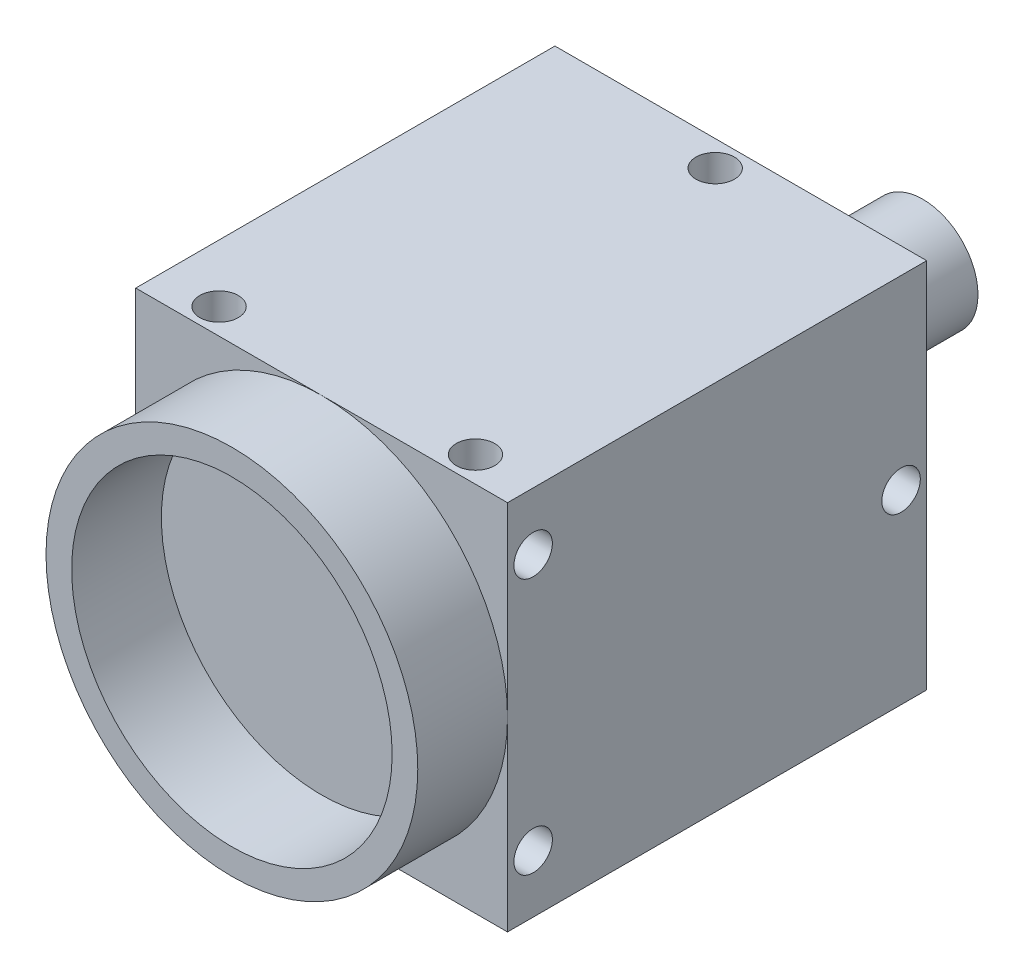
ISO-10303-21;
HEADER;
FILE_DESCRIPTION(('STEP AP214'),'2;1');
FILE_NAME('part.step','',(''),(''),'','','');
FILE_SCHEMA(('AUTOMOTIVE_DESIGN { 1 0 10303 214 1 1 1 1 }'));
ENDSEC;
DATA;
#1=APPLICATION_CONTEXT('core data for automotive mechanical design processes');
#2=APPLICATION_PROTOCOL_DEFINITION('international standard','automotive_design',2000,#1);
#3=PRODUCT_CONTEXT('',#1,'mechanical');
#4=PRODUCT('Part','Part','',(#3));
#5=PRODUCT_RELATED_PRODUCT_CATEGORY('part','',(#4));
#6=PRODUCT_DEFINITION_FORMATION('','',#4);
#7=PRODUCT_DEFINITION_CONTEXT('part definition',#1,'design');
#8=PRODUCT_DEFINITION('design','',#6,#7);
#9=PRODUCT_DEFINITION_SHAPE('','',#8);
#10=(LENGTH_UNIT() NAMED_UNIT(*) SI_UNIT(.MILLI.,.METRE.));
#11=(NAMED_UNIT(*) PLANE_ANGLE_UNIT() SI_UNIT($,.RADIAN.));
#12=(NAMED_UNIT(*) SI_UNIT($,.STERADIAN.) SOLID_ANGLE_UNIT());
#13=UNCERTAINTY_MEASURE_WITH_UNIT(LENGTH_MEASURE(1.E-05),#10,'distance_accuracy_value','');
#14=(GEOMETRIC_REPRESENTATION_CONTEXT(3) GLOBAL_UNCERTAINTY_ASSIGNED_CONTEXT((#13)) GLOBAL_UNIT_ASSIGNED_CONTEXT((#10,
#11,#12)) REPRESENTATION_CONTEXT('',''));
#15=CARTESIAN_POINT('',(0.,0.,0.));
#16=DIRECTION('',(0.,0.,1.));
#17=DIRECTION('',(1.,0.,0.));
#18=AXIS2_PLACEMENT_3D('',#15,#16,#17);
#19=CARTESIAN_POINT('',(-14.5,29.,-16.35));
#20=DIRECTION('',(0.,0.,1.));
#21=DIRECTION('',(1.,0.,0.));
#22=AXIS2_PLACEMENT_3D('',#19,#20,#21);
#23=PLANE('',#22);
#24=CARTESIAN_POINT('',(7.3,21.8,-16.35));
#25=DIRECTION('',(0.,0.,1.));
#26=DIRECTION('',(1.,0.,0.));
#27=AXIS2_PLACEMENT_3D('',#24,#25,#26);
#28=CIRCLE('',#27,4.3);
#29=CARTESIAN_POINT('',(11.6,21.8,-16.35));
#30=VERTEX_POINT('',#29);
#31=EDGE_CURVE('E11',#30,#30,#28,.F.);
#32=ORIENTED_EDGE('',*,*,#31,.F.);
#33=EDGE_LOOP('',(#32));
#34=FACE_BOUND('',#33,.T.);
#35=DIRECTION('',(0.,1.,0.));
#36=VECTOR('',#35,1.);
#37=CARTESIAN_POINT('',(-8.15,15.8,-16.35));
#38=LINE('',#37,#36);
#39=CARTESIAN_POINT('',(-8.15,0.,-16.35));
#40=VERTEX_POINT('',#39);
#41=CARTESIAN_POINT('',(-8.15,15.8,-16.35));
#42=VERTEX_POINT('',#41);
#43=EDGE_CURVE('E135',#40,#42,#38,.T.);
#44=ORIENTED_EDGE('',*,*,#43,.F.);
#45=DIRECTION('',(-1.,0.,0.));
#46=VECTOR('',#45,1.);
#47=CARTESIAN_POINT('',(-14.5,0.,-16.35));
#48=LINE('',#47,#46);
#49=CARTESIAN_POINT('',(-14.5,0.,-16.35));
#50=VERTEX_POINT('',#49);
#51=EDGE_CURVE('E221',#40,#50,#48,.T.);
#52=ORIENTED_EDGE('',*,*,#51,.T.);
#53=DIRECTION('',(0.,-1.,0.));
#54=VECTOR('',#53,1.);
#55=CARTESIAN_POINT('',(-14.5,29.,-16.35));
#56=LINE('',#55,#54);
#57=CARTESIAN_POINT('',(-14.5,29.,-16.35));
#58=VERTEX_POINT('',#57);
#59=EDGE_CURVE('E236',#58,#50,#56,.T.);
#60=ORIENTED_EDGE('',*,*,#59,.F.);
#61=DIRECTION('',(-1.,0.,0.));
#62=VECTOR('',#61,1.);
#63=CARTESIAN_POINT('',(-14.5,29.,-16.35));
#64=LINE('',#63,#62);
#65=CARTESIAN_POINT('',(14.5,29.,-16.35));
#66=VERTEX_POINT('',#65);
#67=EDGE_CURVE('E209',#66,#58,#64,.T.);
#68=ORIENTED_EDGE('',*,*,#67,.F.);
#69=DIRECTION('',(0.,-1.,0.));
#70=VECTOR('',#69,1.);
#71=CARTESIAN_POINT('',(14.5,29.,-16.35));
#72=LINE('',#71,#70);
#73=CARTESIAN_POINT('',(14.5,0.,-16.35));
#74=VERTEX_POINT('',#73);
#75=EDGE_CURVE('E238',#66,#74,#72,.T.);
#76=ORIENTED_EDGE('',*,*,#75,.T.);
#77=CARTESIAN_POINT('',(8.15,0.,-16.35));
#78=VERTEX_POINT('',#77);
#79=EDGE_CURVE('E222',#74,#78,#48,.T.);
#80=ORIENTED_EDGE('',*,*,#79,.T.);
#81=DIRECTION('',(0.,-1.,0.));
#82=VECTOR('',#81,1.);
#83=CARTESIAN_POINT('',(8.15,15.8,-16.35));
#84=LINE('',#83,#82);
#85=CARTESIAN_POINT('',(8.15,15.8,-16.35));
#86=VERTEX_POINT('',#85);
#87=EDGE_CURVE('E58',#86,#78,#84,.T.);
#88=ORIENTED_EDGE('',*,*,#87,.F.);
#89=DIRECTION('',(1.,0.,0.));
#90=VECTOR('',#89,1.);
#91=CARTESIAN_POINT('',(8.15,15.8,-16.35));
#92=LINE('',#91,#90);
#93=EDGE_CURVE('E53',#42,#86,#92,.T.);
#94=ORIENTED_EDGE('',*,*,#93,.F.);
#95=EDGE_LOOP('',(#44,#52,#60,#68,#76,#80,#88,#94));
#96=FACE_BOUND('',#95,.T.);
#97=ADVANCED_FACE('F38',(#34,#96),#23,.F.);
#98=CARTESIAN_POINT('',(-14.5,29.,16.35));
#99=DIRECTION('',(0.,0.,-1.));
#100=DIRECTION('',(-1.,0.,0.));
#101=AXIS2_PLACEMENT_3D('',#98,#99,#100);
#102=PLANE('',#101);
#103=CARTESIAN_POINT('',(0.,14.5,16.35));
#104=DIRECTION('',(0.,0.,1.));
#105=DIRECTION('',(1.,0.,0.));
#106=AXIS2_PLACEMENT_3D('',#103,#104,#105);
#107=CIRCLE('',#106,14.5);
#108=CARTESIAN_POINT('',(14.5,14.5,16.35));
#109=VERTEX_POINT('',#108);
#110=CARTESIAN_POINT('',(0.,29.,16.35));
#111=VERTEX_POINT('',#110);
#112=EDGE_CURVE('E196',#109,#111,#107,.T.);
#113=ORIENTED_EDGE('',*,*,#112,.F.);
#114=DIRECTION('',(0.,-1.,0.));
#115=VECTOR('',#114,1.);
#116=CARTESIAN_POINT('',(14.5,29.,16.35));
#117=LINE('',#116,#115);
#118=CARTESIAN_POINT('',(14.5,29.,16.35));
#119=VERTEX_POINT('',#118);
#120=EDGE_CURVE('E230',#119,#109,#117,.T.);
#121=ORIENTED_EDGE('',*,*,#120,.F.);
#122=DIRECTION('',(1.,0.,0.));
#123=VECTOR('',#122,1.);
#124=CARTESIAN_POINT('',(-14.5,29.,16.35));
#125=LINE('',#124,#123);
#126=EDGE_CURVE('E214',#111,#119,#125,.T.);
#127=ORIENTED_EDGE('',*,*,#126,.F.);
#128=EDGE_LOOP('',(#113,#121,#127));
#129=FACE_BOUND('',#128,.T.);
#130=ADVANCED_FACE('F255',(#129),#102,.F.);
#131=CARTESIAN_POINT('',(-14.5,14.5,16.35));
#132=VERTEX_POINT('',#131);
#133=EDGE_CURVE('E46',#111,#132,#107,.T.);
#134=ORIENTED_EDGE('',*,*,#133,.F.);
#135=CARTESIAN_POINT('',(-14.5,29.,16.35));
#136=VERTEX_POINT('',#135);
#137=EDGE_CURVE('E215',#136,#111,#125,.T.);
#138=ORIENTED_EDGE('',*,*,#137,.F.);
#139=DIRECTION('',(0.,-1.,0.));
#140=VECTOR('',#139,1.);
#141=CARTESIAN_POINT('',(-14.5,29.,16.35));
#142=LINE('',#141,#140);
#143=EDGE_CURVE('E233',#136,#132,#142,.T.);
#144=ORIENTED_EDGE('',*,*,#143,.T.);
#145=EDGE_LOOP('',(#134,#138,#144));
#146=FACE_BOUND('',#145,.T.);
#147=ADVANCED_FACE('F251',(#146),#102,.F.);
#148=CARTESIAN_POINT('',(0.,0.,16.35));
#149=VERTEX_POINT('',#148);
#150=EDGE_CURVE('E242',#132,#149,#107,.T.);
#151=ORIENTED_EDGE('',*,*,#150,.F.);
#152=CARTESIAN_POINT('',(-14.5,0.,16.35));
#153=VERTEX_POINT('',#152);
#154=EDGE_CURVE('E232',#132,#153,#142,.T.);
#155=ORIENTED_EDGE('',*,*,#154,.T.);
#156=DIRECTION('',(1.,0.,0.));
#157=VECTOR('',#156,1.);
#158=CARTESIAN_POINT('',(-14.5,0.,16.35));
#159=LINE('',#158,#157);
#160=EDGE_CURVE('E210',#153,#149,#159,.T.);
#161=ORIENTED_EDGE('',*,*,#160,.T.);
#162=EDGE_LOOP('',(#151,#155,#161));
#163=FACE_BOUND('',#162,.T.);
#164=ADVANCED_FACE('F267',(#163),#102,.F.);
#165=CARTESIAN_POINT('',(14.5,29.,-16.35));
#166=DIRECTION('',(-1.,0.,0.));
#167=DIRECTION('',(0.,0.,1.));
#168=AXIS2_PLACEMENT_3D('',#165,#166,#167);
#169=PLANE('',#168);
#170=CARTESIAN_POINT('',(14.5,24.4999999999999,14.35));
#171=DIRECTION('',(1.,0.,0.));
#172=DIRECTION('',(0.,0.,1.));
#173=AXIS2_PLACEMENT_3D('',#170,#171,#172);
#174=CIRCLE('',#173,1.5);
#175=CARTESIAN_POINT('',(14.5,24.4999999999999,15.85));
#176=VERTEX_POINT('',#175);
#177=EDGE_CURVE('E695',#176,#176,#174,.T.);
#178=ORIENTED_EDGE('',*,*,#177,.F.);
#179=EDGE_LOOP('',(#178));
#180=FACE_BOUND('',#179,.T.);
#181=CARTESIAN_POINT('',(14.5,4.49999999999994,14.35));
#182=DIRECTION('',(1.,0.,0.));
#183=DIRECTION('',(0.,0.,-1.));
#184=AXIS2_PLACEMENT_3D('',#181,#182,#183);
#185=CIRCLE('',#184,1.5);
#186=CARTESIAN_POINT('',(14.5,4.49999999999994,12.85));
#187=VERTEX_POINT('',#186);
#188=EDGE_CURVE('E709',#187,#187,#185,.T.);
#189=ORIENTED_EDGE('',*,*,#188,.F.);
#190=EDGE_LOOP('',(#189));
#191=FACE_BOUND('',#190,.T.);
#192=CARTESIAN_POINT('',(14.5,14.5,-14.35));
#193=DIRECTION('',(1.,0.,0.));
#194=DIRECTION('',(0.,0.,1.));
#195=AXIS2_PLACEMENT_3D('',#192,#193,#194);
#196=CIRCLE('',#195,1.5);
#197=CARTESIAN_POINT('',(14.5,14.5,-12.85));
#198=VERTEX_POINT('',#197);
#199=EDGE_CURVE('E694',#198,#198,#196,.T.);
#200=ORIENTED_EDGE('',*,*,#199,.F.);
#201=EDGE_LOOP('',(#200));
#202=FACE_BOUND('',#201,.T.);
#203=DIRECTION('',(0.,0.,-1.));
#204=VECTOR('',#203,1.);
#205=CARTESIAN_POINT('',(14.5,0.,-16.35));
#206=LINE('',#205,#204);
#207=CARTESIAN_POINT('',(14.5,0.,16.35));
#208=VERTEX_POINT('',#207);
#209=EDGE_CURVE('E202',#208,#74,#206,.T.);
#210=ORIENTED_EDGE('',*,*,#209,.T.);
#211=ORIENTED_EDGE('',*,*,#75,.F.);
#212=DIRECTION('',(0.,0.,-1.));
#213=VECTOR('',#212,1.);
#214=CARTESIAN_POINT('',(14.5,29.,-16.35));
#215=LINE('',#214,#213);
#216=EDGE_CURVE('E206',#119,#66,#215,.T.);
#217=ORIENTED_EDGE('',*,*,#216,.F.);
#218=ORIENTED_EDGE('',*,*,#120,.T.);
#219=EDGE_CURVE('E218',#109,#208,#117,.T.);
#220=ORIENTED_EDGE('',*,*,#219,.T.);
#221=EDGE_LOOP('',(#210,#211,#217,#218,#220));
#222=FACE_BOUND('',#221,.T.);
#223=ADVANCED_FACE('F40',(#180,#191,#202,#222),#169,.F.);
#224=CARTESIAN_POINT('',(-14.5,29.,-16.35));
#225=DIRECTION('',(1.,0.,0.));
#226=DIRECTION('',(0.,0.,-1.));
#227=AXIS2_PLACEMENT_3D('',#224,#225,#226);
#228=PLANE('',#227);
#229=CARTESIAN_POINT('',(-14.5,14.5000000000001,-14.35));
#230=DIRECTION('',(-1.,0.,0.));
#231=DIRECTION('',(0.,0.,1.));
#232=AXIS2_PLACEMENT_3D('',#229,#230,#231);
#233=CIRCLE('',#232,1.5);
#234=CARTESIAN_POINT('',(-14.5,14.5000000000001,-12.85));
#235=VERTEX_POINT('',#234);
#236=EDGE_CURVE('E715',#235,#235,#233,.T.);
#237=ORIENTED_EDGE('',*,*,#236,.F.);
#238=EDGE_LOOP('',(#237));
#239=FACE_BOUND('',#238,.T.);
#240=CARTESIAN_POINT('',(-14.5000000000001,4.50000000000017,14.35));
#241=DIRECTION('',(-1.,0.,0.));
#242=DIRECTION('',(0.,0.,1.));
#243=AXIS2_PLACEMENT_3D('',#240,#241,#242);
#244=CIRCLE('',#243,1.5);
#245=CARTESIAN_POINT('',(-14.5000000000001,4.50000000000017,15.85));
#246=VERTEX_POINT('',#245);
#247=EDGE_CURVE('E721',#246,#246,#244,.T.);
#248=ORIENTED_EDGE('',*,*,#247,.F.);
#249=EDGE_LOOP('',(#248));
#250=FACE_BOUND('',#249,.T.);
#251=CARTESIAN_POINT('',(-14.4999999999999,24.5000000000002,14.35));
#252=DIRECTION('',(-1.,0.,0.));
#253=DIRECTION('',(0.,0.,-1.));
#254=AXIS2_PLACEMENT_3D('',#251,#252,#253);
#255=CIRCLE('',#254,1.5);
#256=CARTESIAN_POINT('',(-14.4999999999999,24.5000000000002,12.85));
#257=VERTEX_POINT('',#256);
#258=EDGE_CURVE('E704',#257,#257,#255,.T.);
#259=ORIENTED_EDGE('',*,*,#258,.F.);
#260=EDGE_LOOP('',(#259));
#261=FACE_BOUND('',#260,.T.);
#262=DIRECTION('',(0.,0.,1.));
#263=VECTOR('',#262,1.);
#264=CARTESIAN_POINT('',(-14.5,0.,-16.35));
#265=LINE('',#264,#263);
#266=EDGE_CURVE('E224',#50,#153,#265,.T.);
#267=ORIENTED_EDGE('',*,*,#266,.T.);
#268=ORIENTED_EDGE('',*,*,#154,.F.);
#269=ORIENTED_EDGE('',*,*,#143,.F.);
#270=DIRECTION('',(0.,0.,1.));
#271=VECTOR('',#270,1.);
#272=CARTESIAN_POINT('',(-14.5,29.,-16.35));
#273=LINE('',#272,#271);
#274=EDGE_CURVE('E212',#58,#136,#273,.T.);
#275=ORIENTED_EDGE('',*,*,#274,.F.);
#276=ORIENTED_EDGE('',*,*,#59,.T.);
#277=EDGE_LOOP('',(#267,#268,#269,#275,#276));
#278=FACE_BOUND('',#277,.T.);
#279=ADVANCED_FACE('F263',(#239,#250,#261,#278),#228,.F.);
#280=EDGE_CURVE('E205',#149,#109,#107,.T.);
#281=ORIENTED_EDGE('',*,*,#280,.F.);
#282=EDGE_CURVE('E227',#149,#208,#159,.T.);
#283=ORIENTED_EDGE('',*,*,#282,.T.);
#284=ORIENTED_EDGE('',*,*,#219,.F.);
#285=EDGE_LOOP('',(#281,#283,#284));
#286=FACE_BOUND('',#285,.T.);
#287=ADVANCED_FACE('F275',(#286),#102,.F.);
#288=CARTESIAN_POINT('',(0.,29.,0.));
#289=DIRECTION('',(0.,1.,0.));
#290=DIRECTION('',(0.,0.,1.));
#291=AXIS2_PLACEMENT_3D('',#288,#289,#290);
#292=PLANE('',#291);
#293=CARTESIAN_POINT('',(0.,29.,-14.35));
#294=DIRECTION('',(0.,1.,0.));
#295=DIRECTION('',(0.,0.,1.));
#296=AXIS2_PLACEMENT_3D('',#293,#294,#295);
#297=CIRCLE('',#296,1.5);
#298=CARTESIAN_POINT('',(0.,29.,-12.85));
#299=VERTEX_POINT('',#298);
#300=EDGE_CURVE('E155',#299,#299,#297,.T.);
#301=ORIENTED_EDGE('',*,*,#300,.F.);
#302=EDGE_LOOP('',(#301));
#303=FACE_BOUND('',#302,.T.);
#304=CARTESIAN_POINT('',(-9.99999999999999,29.,14.35));
#305=DIRECTION('',(0.,1.,0.));
#306=DIRECTION('',(0.,0.,1.));
#307=AXIS2_PLACEMENT_3D('',#304,#305,#306);
#308=CIRCLE('',#307,1.5);
#309=CARTESIAN_POINT('',(-9.99999999999999,29.,15.85));
#310=VERTEX_POINT('',#309);
#311=EDGE_CURVE('E158',#310,#310,#308,.T.);
#312=ORIENTED_EDGE('',*,*,#311,.F.);
#313=EDGE_LOOP('',(#312));
#314=FACE_BOUND('',#313,.T.);
#315=CARTESIAN_POINT('',(10.,29.,14.35));
#316=DIRECTION('',(0.,1.,0.));
#317=DIRECTION('',(0.,0.,-1.));
#318=AXIS2_PLACEMENT_3D('',#315,#316,#317);
#319=CIRCLE('',#318,1.5);
#320=CARTESIAN_POINT('',(10.,29.,12.85));
#321=VERTEX_POINT('',#320);
#322=EDGE_CURVE('E164',#321,#321,#319,.T.);
#323=ORIENTED_EDGE('',*,*,#322,.F.);
#324=EDGE_LOOP('',(#323));
#325=FACE_BOUND('',#324,.T.);
#326=ORIENTED_EDGE('',*,*,#216,.T.);
#327=ORIENTED_EDGE('',*,*,#67,.T.);
#328=ORIENTED_EDGE('',*,*,#274,.T.);
#329=ORIENTED_EDGE('',*,*,#137,.T.);
#330=ORIENTED_EDGE('',*,*,#126,.T.);
#331=EDGE_LOOP('',(#326,#327,#328,#329,#330));
#332=FACE_BOUND('',#331,.T.);
#333=ADVANCED_FACE('F258',(#303,#314,#325,#332),#292,.T.);
#334=CARTESIAN_POINT('',(0.,0.,0.));
#335=DIRECTION('',(0.,1.,0.));
#336=DIRECTION('',(0.,0.,1.));
#337=AXIS2_PLACEMENT_3D('',#334,#335,#336);
#338=PLANE('',#337);
#339=CARTESIAN_POINT('',(10.,0.,14.35));
#340=DIRECTION('',(0.,-1.,0.));
#341=DIRECTION('',(0.,0.,-1.));
#342=AXIS2_PLACEMENT_3D('',#339,#340,#341);
#343=CIRCLE('',#342,1.5);
#344=CARTESIAN_POINT('',(10.,0.,12.85));
#345=VERTEX_POINT('',#344);
#346=EDGE_CURVE('E175',#345,#345,#343,.T.);
#347=ORIENTED_EDGE('',*,*,#346,.F.);
#348=EDGE_LOOP('',(#347));
#349=FACE_BOUND('',#348,.T.);
#350=CARTESIAN_POINT('',(-10.,0.,-14.35));
#351=DIRECTION('',(0.,-1.,0.));
#352=DIRECTION('',(0.,0.,-1.));
#353=AXIS2_PLACEMENT_3D('',#350,#351,#352);
#354=CIRCLE('',#353,1.5);
#355=CARTESIAN_POINT('',(-10.,0.,-15.85));
#356=VERTEX_POINT('',#355);
#357=EDGE_CURVE('E182',#356,#356,#354,.T.);
#358=ORIENTED_EDGE('',*,*,#357,.F.);
#359=EDGE_LOOP('',(#358));
#360=FACE_BOUND('',#359,.T.);
#361=CARTESIAN_POINT('',(10.,0.,-14.35));
#362=DIRECTION('',(0.,-1.,0.));
#363=DIRECTION('',(0.,0.,-1.));
#364=AXIS2_PLACEMENT_3D('',#361,#362,#363);
#365=CIRCLE('',#364,1.5);
#366=CARTESIAN_POINT('',(10.,0.,-15.85));
#367=VERTEX_POINT('',#366);
#368=EDGE_CURVE('E169',#367,#367,#365,.T.);
#369=ORIENTED_EDGE('',*,*,#368,.F.);
#370=EDGE_LOOP('',(#369));
#371=FACE_BOUND('',#370,.T.);
#372=CARTESIAN_POINT('',(-10.,0.,14.35));
#373=DIRECTION('',(0.,-1.,0.));
#374=DIRECTION('',(0.,0.,-1.));
#375=AXIS2_PLACEMENT_3D('',#372,#373,#374);
#376=CIRCLE('',#375,1.5);
#377=CARTESIAN_POINT('',(-10.,0.,12.85));
#378=VERTEX_POINT('',#377);
#379=EDGE_CURVE('E178',#378,#378,#376,.T.);
#380=ORIENTED_EDGE('',*,*,#379,.F.);
#381=EDGE_LOOP('',(#380));
#382=FACE_BOUND('',#381,.T.);
#383=ORIENTED_EDGE('',*,*,#209,.F.);
#384=ORIENTED_EDGE('',*,*,#282,.F.);
#385=ORIENTED_EDGE('',*,*,#160,.F.);
#386=ORIENTED_EDGE('',*,*,#266,.F.);
#387=ORIENTED_EDGE('',*,*,#51,.F.);
#388=DIRECTION('',(0.,0.,1.));
#389=VECTOR('',#388,1.);
#390=CARTESIAN_POINT('',(-8.15,0.,-18.35));
#391=LINE('',#390,#389);
#392=CARTESIAN_POINT('',(-8.15,0.,-18.35));
#393=VERTEX_POINT('',#392);
#394=EDGE_CURVE('E729',#393,#40,#391,.T.);
#395=ORIENTED_EDGE('',*,*,#394,.F.);
#396=DIRECTION('',(-1.,0.,0.));
#397=VECTOR('',#396,1.);
#398=CARTESIAN_POINT('',(8.15,0.,-18.35));
#399=LINE('',#398,#397);
#400=CARTESIAN_POINT('',(8.15,0.,-18.35));
#401=VERTEX_POINT('',#400);
#402=EDGE_CURVE('E129',#401,#393,#399,.T.);
#403=ORIENTED_EDGE('',*,*,#402,.F.);
#404=DIRECTION('',(0.,0.,1.));
#405=VECTOR('',#404,1.);
#406=CARTESIAN_POINT('',(8.15,0.,-18.35));
#407=LINE('',#406,#405);
#408=EDGE_CURVE('E141',#401,#78,#407,.T.);
#409=ORIENTED_EDGE('',*,*,#408,.T.);
#410=ORIENTED_EDGE('',*,*,#79,.F.);
#411=EDGE_LOOP('',(#383,#384,#385,#386,#387,#395,#403,#409,#410));
#412=FACE_BOUND('',#411,.T.);
#413=ADVANCED_FACE('F271',(#349,#360,#371,#382,#412),#338,.F.);
#414=CARTESIAN_POINT('',(0.,14.5,23.35));
#415=DIRECTION('',(0.,0.,1.));
#416=DIRECTION('',(1.,0.,0.));
#417=AXIS2_PLACEMENT_3D('',#414,#415,#416);
#418=PLANE('',#417);
#419=CARTESIAN_POINT('',(0.,14.5,23.35));
#420=DIRECTION('',(0.,0.,1.));
#421=DIRECTION('',(1.,0.,0.));
#422=AXIS2_PLACEMENT_3D('',#419,#420,#421);
#423=CIRCLE('',#422,14.5);
#424=CARTESIAN_POINT('',(14.5,14.5,23.35));
#425=VERTEX_POINT('',#424);
#426=EDGE_CURVE('E199',#425,#425,#423,.T.);
#427=ORIENTED_EDGE('',*,*,#426,.T.);
#428=EDGE_LOOP('',(#427));
#429=FACE_BOUND('',#428,.T.);
#430=CARTESIAN_POINT('',(0.,14.5,23.35));
#431=DIRECTION('',(0.,0.,1.));
#432=DIRECTION('',(1.,0.,0.));
#433=AXIS2_PLACEMENT_3D('',#430,#431,#432);
#434=CIRCLE('',#433,12.5);
#435=CARTESIAN_POINT('',(12.5,14.5,23.35));
#436=VERTEX_POINT('',#435);
#437=EDGE_CURVE('E193',#436,#436,#434,.T.);
#438=ORIENTED_EDGE('',*,*,#437,.F.);
#439=EDGE_LOOP('',(#438));
#440=FACE_BOUND('',#439,.T.);
#441=ADVANCED_FACE('F380',(#429,#440),#418,.T.);
#442=CARTESIAN_POINT('',(0.,14.5,23.35));
#443=DIRECTION('',(0.,0.,-1.));
#444=DIRECTION('',(-1.,0.,0.));
#445=AXIS2_PLACEMENT_3D('',#442,#443,#444);
#446=CYLINDRICAL_SURFACE('',#445,14.5);
#447=ORIENTED_EDGE('',*,*,#426,.F.);
#448=EDGE_LOOP('',(#447));
#449=FACE_BOUND('',#448,.T.);
#450=ORIENTED_EDGE('',*,*,#112,.T.);
#451=ORIENTED_EDGE('',*,*,#133,.T.);
#452=ORIENTED_EDGE('',*,*,#150,.T.);
#453=ORIENTED_EDGE('',*,*,#280,.T.);
#454=EDGE_LOOP('',(#450,#451,#452,#453));
#455=FACE_BOUND('',#454,.T.);
#456=ADVANCED_FACE('F246',(#449,#455),#446,.T.);
#457=CARTESIAN_POINT('',(0.,14.5,23.35));
#458=DIRECTION('',(0.,0.,-1.));
#459=DIRECTION('',(-1.,0.,0.));
#460=AXIS2_PLACEMENT_3D('',#457,#458,#459);
#461=CYLINDRICAL_SURFACE('',#460,12.5);
#462=ORIENTED_EDGE('',*,*,#437,.T.);
#463=EDGE_LOOP('',(#462));
#464=FACE_BOUND('',#463,.T.);
#465=CARTESIAN_POINT('',(0.,14.5,16.35));
#466=DIRECTION('',(0.,0.,1.));
#467=DIRECTION('',(1.,0.,0.));
#468=AXIS2_PLACEMENT_3D('',#465,#466,#467);
#469=CIRCLE('',#468,12.5);
#470=CARTESIAN_POINT('',(12.5,14.5,16.35));
#471=VERTEX_POINT('',#470);
#472=EDGE_CURVE('E190',#471,#471,#469,.T.);
#473=ORIENTED_EDGE('',*,*,#472,.F.);
#474=EDGE_LOOP('',(#473));
#475=FACE_BOUND('',#474,.T.);
#476=ADVANCED_FACE('F376',(#464,#475),#461,.F.);
#477=ORIENTED_EDGE('',*,*,#472,.T.);
#478=EDGE_LOOP('',(#477));
#479=FACE_BOUND('',#478,.T.);
#480=ADVANCED_FACE('F286',(#479),#102,.F.);
#481=CARTESIAN_POINT('',(-10.,5.,14.35));
#482=DIRECTION('',(0.,-1.,0.));
#483=DIRECTION('',(0.,0.,-1.));
#484=AXIS2_PLACEMENT_3D('',#481,#482,#483);
#485=CYLINDRICAL_SURFACE('',#484,1.5);
#486=CARTESIAN_POINT('',(-10.,5.,14.35));
#487=DIRECTION('',(0.,-1.,0.));
#488=DIRECTION('',(0.,0.,-1.));
#489=AXIS2_PLACEMENT_3D('',#486,#487,#488);
#490=CIRCLE('',#489,1.5);
#491=CARTESIAN_POINT('',(-10.,5.,12.85));
#492=VERTEX_POINT('',#491);
#493=EDGE_CURVE('E187',#492,#492,#490,.T.);
#494=ORIENTED_EDGE('',*,*,#493,.F.);
#495=EDGE_LOOP('',(#494));
#496=FACE_BOUND('',#495,.T.);
#497=ORIENTED_EDGE('',*,*,#379,.T.);
#498=EDGE_LOOP('',(#497));
#499=FACE_BOUND('',#498,.T.);
#500=ADVANCED_FACE('F371',(#496,#499),#485,.F.);
#501=CARTESIAN_POINT('',(-10.,5.,14.35));
#502=DIRECTION('',(0.,-1.,0.));
#503=DIRECTION('',(0.,0.,-1.));
#504=AXIS2_PLACEMENT_3D('',#501,#502,#503);
#505=PLANE('',#504);
#506=ORIENTED_EDGE('',*,*,#493,.T.);
#507=EDGE_LOOP('',(#506));
#508=FACE_BOUND('',#507,.T.);
#509=ADVANCED_FACE('F349',(#508),#505,.T.);
#510=CARTESIAN_POINT('',(10.,5.,-14.35));
#511=DIRECTION('',(0.,-1.,0.));
#512=DIRECTION('',(0.,0.,-1.));
#513=AXIS2_PLACEMENT_3D('',#510,#511,#512);
#514=CYLINDRICAL_SURFACE('',#513,1.5);
#515=CARTESIAN_POINT('',(10.,5.,-14.35));
#516=DIRECTION('',(0.,-1.,0.));
#517=DIRECTION('',(0.,0.,-1.));
#518=AXIS2_PLACEMENT_3D('',#515,#516,#517);
#519=CIRCLE('',#518,1.5);
#520=CARTESIAN_POINT('',(10.,5.,-15.85));
#521=VERTEX_POINT('',#520);
#522=EDGE_CURVE('E154',#521,#521,#519,.T.);
#523=ORIENTED_EDGE('',*,*,#522,.F.);
#524=EDGE_LOOP('',(#523));
#525=FACE_BOUND('',#524,.T.);
#526=ORIENTED_EDGE('',*,*,#368,.T.);
#527=EDGE_LOOP('',(#526));
#528=FACE_BOUND('',#527,.T.);
#529=ADVANCED_FACE('F345',(#525,#528),#514,.F.);
#530=CARTESIAN_POINT('',(10.,5.,-14.35));
#531=DIRECTION('',(0.,-1.,0.));
#532=DIRECTION('',(0.,0.,-1.));
#533=AXIS2_PLACEMENT_3D('',#530,#531,#532);
#534=PLANE('',#533);
#535=ORIENTED_EDGE('',*,*,#522,.T.);
#536=EDGE_LOOP('',(#535));
#537=FACE_BOUND('',#536,.T.);
#538=ADVANCED_FACE('F348',(#537),#534,.T.);
#539=CARTESIAN_POINT('',(-10.,5.,-14.35));
#540=DIRECTION('',(0.,-1.,0.));
#541=DIRECTION('',(0.,0.,-1.));
#542=AXIS2_PLACEMENT_3D('',#539,#540,#541);
#543=CYLINDRICAL_SURFACE('',#542,1.5);
#544=CARTESIAN_POINT('',(-10.,5.,-14.35));
#545=DIRECTION('',(0.,-1.,0.));
#546=DIRECTION('',(0.,0.,-1.));
#547=AXIS2_PLACEMENT_3D('',#544,#545,#546);
#548=CIRCLE('',#547,1.5);
#549=CARTESIAN_POINT('',(-10.,5.,-15.85));
#550=VERTEX_POINT('',#549);
#551=EDGE_CURVE('E172',#550,#550,#548,.T.);
#552=ORIENTED_EDGE('',*,*,#551,.F.);
#553=EDGE_LOOP('',(#552));
#554=FACE_BOUND('',#553,.T.);
#555=ORIENTED_EDGE('',*,*,#357,.T.);
#556=EDGE_LOOP('',(#555));
#557=FACE_BOUND('',#556,.T.);
#558=ADVANCED_FACE('F353',(#554,#557),#543,.F.);
#559=CARTESIAN_POINT('',(-10.,5.,-14.35));
#560=DIRECTION('',(0.,-1.,0.));
#561=DIRECTION('',(0.,0.,-1.));
#562=AXIS2_PLACEMENT_3D('',#559,#560,#561);
#563=PLANE('',#562);
#564=ORIENTED_EDGE('',*,*,#551,.T.);
#565=EDGE_LOOP('',(#564));
#566=FACE_BOUND('',#565,.T.);
#567=ADVANCED_FACE('F358',(#566),#563,.T.);
#568=CARTESIAN_POINT('',(10.,5.,14.35));
#569=DIRECTION('',(0.,-1.,0.));
#570=DIRECTION('',(0.,0.,-1.));
#571=AXIS2_PLACEMENT_3D('',#568,#569,#570);
#572=CYLINDRICAL_SURFACE('',#571,1.5);
#573=CARTESIAN_POINT('',(10.,5.,14.35));
#574=DIRECTION('',(0.,-1.,0.));
#575=DIRECTION('',(0.,0.,-1.));
#576=AXIS2_PLACEMENT_3D('',#573,#574,#575);
#577=CIRCLE('',#576,1.5);
#578=CARTESIAN_POINT('',(10.,5.,12.85));
#579=VERTEX_POINT('',#578);
#580=EDGE_CURVE('E179',#579,#579,#577,.T.);
#581=ORIENTED_EDGE('',*,*,#580,.F.);
#582=EDGE_LOOP('',(#581));
#583=FACE_BOUND('',#582,.T.);
#584=ORIENTED_EDGE('',*,*,#346,.T.);
#585=EDGE_LOOP('',(#584));
#586=FACE_BOUND('',#585,.T.);
#587=ADVANCED_FACE('F355',(#583,#586),#572,.F.);
#588=CARTESIAN_POINT('',(10.,5.,14.35));
#589=DIRECTION('',(0.,-1.,0.));
#590=DIRECTION('',(0.,0.,-1.));
#591=AXIS2_PLACEMENT_3D('',#588,#589,#590);
#592=PLANE('',#591);
#593=ORIENTED_EDGE('',*,*,#580,.T.);
#594=EDGE_LOOP('',(#593));
#595=FACE_BOUND('',#594,.T.);
#596=ADVANCED_FACE('F340',(#595),#592,.T.);
#597=CARTESIAN_POINT('',(10.,26.1,14.35));
#598=DIRECTION('',(0.,1.,0.));
#599=DIRECTION('',(0.,0.,1.));
#600=AXIS2_PLACEMENT_3D('',#597,#598,#599);
#601=CYLINDRICAL_SURFACE('',#600,1.5);
#602=CARTESIAN_POINT('',(10.,26.1,14.35));
#603=DIRECTION('',(0.,1.,0.));
#604=DIRECTION('',(0.,0.,-1.));
#605=AXIS2_PLACEMENT_3D('',#602,#603,#604);
#606=CIRCLE('',#605,1.5);
#607=CARTESIAN_POINT('',(10.,26.1,12.85));
#608=VERTEX_POINT('',#607);
#609=EDGE_CURVE('E150',#608,#608,#606,.T.);
#610=ORIENTED_EDGE('',*,*,#609,.F.);
#611=EDGE_LOOP('',(#610));
#612=FACE_BOUND('',#611,.T.);
#613=ORIENTED_EDGE('',*,*,#322,.T.);
#614=EDGE_LOOP('',(#613));
#615=FACE_BOUND('',#614,.T.);
#616=ADVANCED_FACE('F337',(#612,#615),#601,.F.);
#617=CARTESIAN_POINT('',(10.,26.1,14.35));
#618=DIRECTION('',(0.,-1.,0.));
#619=DIRECTION('',(0.,0.,-1.));
#620=AXIS2_PLACEMENT_3D('',#617,#618,#619);
#621=PLANE('',#620);
#622=ORIENTED_EDGE('',*,*,#609,.T.);
#623=EDGE_LOOP('',(#622));
#624=FACE_BOUND('',#623,.T.);
#625=ADVANCED_FACE('F332',(#624),#621,.F.);
#626=CARTESIAN_POINT('',(-9.99999999999999,26.1,14.35));
#627=DIRECTION('',(0.,1.,0.));
#628=DIRECTION('',(0.,0.,1.));
#629=AXIS2_PLACEMENT_3D('',#626,#627,#628);
#630=CYLINDRICAL_SURFACE('',#629,1.5);
#631=CARTESIAN_POINT('',(-9.99999999999999,26.1,14.35));
#632=DIRECTION('',(0.,1.,0.));
#633=DIRECTION('',(0.,0.,1.));
#634=AXIS2_PLACEMENT_3D('',#631,#632,#633);
#635=CIRCLE('',#634,1.5);
#636=CARTESIAN_POINT('',(-9.99999999999999,26.1,15.85));
#637=VERTEX_POINT('',#636);
#638=EDGE_CURVE('E161',#637,#637,#635,.T.);
#639=ORIENTED_EDGE('',*,*,#638,.F.);
#640=EDGE_LOOP('',(#639));
#641=FACE_BOUND('',#640,.T.);
#642=ORIENTED_EDGE('',*,*,#311,.T.);
#643=EDGE_LOOP('',(#642));
#644=FACE_BOUND('',#643,.T.);
#645=ADVANCED_FACE('F329',(#641,#644),#630,.F.);
#646=CARTESIAN_POINT('',(-9.99999999999999,26.1,14.35));
#647=DIRECTION('',(0.,1.,0.));
#648=DIRECTION('',(0.,0.,1.));
#649=AXIS2_PLACEMENT_3D('',#646,#647,#648);
#650=PLANE('',#649);
#651=ORIENTED_EDGE('',*,*,#638,.T.);
#652=EDGE_LOOP('',(#651));
#653=FACE_BOUND('',#652,.T.);
#654=ADVANCED_FACE('F327',(#653),#650,.T.);
#655=CARTESIAN_POINT('',(0.,26.1,-14.35));
#656=DIRECTION('',(0.,1.,0.));
#657=DIRECTION('',(0.,0.,1.));
#658=AXIS2_PLACEMENT_3D('',#655,#656,#657);
#659=CYLINDRICAL_SURFACE('',#658,1.5);
#660=CARTESIAN_POINT('',(0.,26.1,-14.35));
#661=DIRECTION('',(0.,1.,0.));
#662=DIRECTION('',(0.,0.,1.));
#663=AXIS2_PLACEMENT_3D('',#660,#661,#662);
#664=CIRCLE('',#663,1.5);
#665=CARTESIAN_POINT('',(0.,26.1,-12.85));
#666=VERTEX_POINT('',#665);
#667=EDGE_CURVE('E151',#666,#666,#664,.T.);
#668=ORIENTED_EDGE('',*,*,#667,.F.);
#669=EDGE_LOOP('',(#668));
#670=FACE_BOUND('',#669,.T.);
#671=ORIENTED_EDGE('',*,*,#300,.T.);
#672=EDGE_LOOP('',(#671));
#673=FACE_BOUND('',#672,.T.);
#674=ADVANCED_FACE('F323',(#670,#673),#659,.F.);
#675=CARTESIAN_POINT('',(0.,26.1,-14.35));
#676=DIRECTION('',(0.,1.,0.));
#677=DIRECTION('',(0.,0.,1.));
#678=AXIS2_PLACEMENT_3D('',#675,#676,#677);
#679=PLANE('',#678);
#680=ORIENTED_EDGE('',*,*,#667,.T.);
#681=EDGE_LOOP('',(#680));
#682=FACE_BOUND('',#681,.T.);
#683=ADVANCED_FACE('F318',(#682),#679,.T.);
#684=CARTESIAN_POINT('',(7.3,21.8,-23.25));
#685=DIRECTION('',(0.,0.,-1.));
#686=DIRECTION('',(-1.,0.,0.));
#687=AXIS2_PLACEMENT_3D('',#684,#685,#686);
#688=PLANE('',#687);
#689=CARTESIAN_POINT('',(7.3,21.8,-23.25));
#690=DIRECTION('',(0.,0.,-1.));
#691=DIRECTION('',(-1.,0.,0.));
#692=AXIS2_PLACEMENT_3D('',#689,#690,#691);
#693=CIRCLE('',#692,4.3);
#694=CARTESIAN_POINT('',(11.6,21.8,-23.25));
#695=VERTEX_POINT('',#694);
#696=EDGE_CURVE('E146',#695,#695,#693,.T.);
#697=ORIENTED_EDGE('',*,*,#696,.T.);
#698=EDGE_LOOP('',(#697));
#699=FACE_BOUND('',#698,.T.);
#700=CARTESIAN_POINT('',(7.3,21.8,-23.25));
#701=DIRECTION('',(0.,0.,-1.));
#702=DIRECTION('',(-1.,0.,0.));
#703=AXIS2_PLACEMENT_3D('',#700,#701,#702);
#704=CIRCLE('',#703,3.5);
#705=CARTESIAN_POINT('',(10.8,21.8,-23.25));
#706=VERTEX_POINT('',#705);
#707=EDGE_CURVE('E139',#706,#706,#704,.T.);
#708=ORIENTED_EDGE('',*,*,#707,.F.);
#709=EDGE_LOOP('',(#708));
#710=FACE_BOUND('',#709,.T.);
#711=ADVANCED_FACE('F312',(#699,#710),#688,.T.);
#712=CARTESIAN_POINT('',(7.3,21.8,-23.25));
#713=DIRECTION('',(0.,0.,1.));
#714=DIRECTION('',(1.,0.,0.));
#715=AXIS2_PLACEMENT_3D('',#712,#713,#714);
#716=CYLINDRICAL_SURFACE('',#715,4.3);
#717=CARTESIAN_POINT('',(11.6,21.8,-23.25));
#718=CARTESIAN_POINT('',(11.6,21.8,-23.178125));
#719=CARTESIAN_POINT('',(11.6,21.8,-23.10625));
#720=CARTESIAN_POINT('',(11.6,21.8,-22.9625));
#721=CARTESIAN_POINT('',(11.6,21.8,-22.890625));
#722=CARTESIAN_POINT('',(11.6,21.8,-22.746875));
#723=CARTESIAN_POINT('',(11.6,21.8,-22.675));
#724=CARTESIAN_POINT('',(11.6,21.8,-22.53125));
#725=CARTESIAN_POINT('',(11.6,21.8,-22.459375));
#726=CARTESIAN_POINT('',(11.6,21.8,-22.315625));
#727=CARTESIAN_POINT('',(11.6,21.8,-22.24375));
#728=CARTESIAN_POINT('',(11.6,21.8,-22.1));
#729=CARTESIAN_POINT('',(11.6,21.8,-22.028125));
#730=CARTESIAN_POINT('',(11.6,21.8,-21.884375));
#731=CARTESIAN_POINT('',(11.6,21.8,-21.8125));
#732=CARTESIAN_POINT('',(11.6,21.8,-21.66875));
#733=CARTESIAN_POINT('',(11.6,21.8,-21.596875));
#734=CARTESIAN_POINT('',(11.6,21.8,-21.453125));
#735=CARTESIAN_POINT('',(11.6,21.8,-21.38125));
#736=CARTESIAN_POINT('',(11.6,21.8,-21.2375));
#737=CARTESIAN_POINT('',(11.6,21.8,-21.165625));
#738=CARTESIAN_POINT('',(11.6,21.8,-21.021875));
#739=CARTESIAN_POINT('',(11.6,21.8,-20.95));
#740=CARTESIAN_POINT('',(11.6,21.8,-20.80625));
#741=CARTESIAN_POINT('',(11.6,21.8,-20.734375));
#742=CARTESIAN_POINT('',(11.6,21.8,-20.590625));
#743=CARTESIAN_POINT('',(11.6,21.8,-20.51875));
#744=CARTESIAN_POINT('',(11.6,21.8,-20.375));
#745=CARTESIAN_POINT('',(11.6,21.8,-20.303125));
#746=CARTESIAN_POINT('',(11.6,21.8,-20.159375));
#747=CARTESIAN_POINT('',(11.6,21.8,-20.0875));
#748=CARTESIAN_POINT('',(11.6,21.8,-19.94375));
#749=CARTESIAN_POINT('',(11.6,21.8,-19.871875));
#750=CARTESIAN_POINT('',(11.6,21.8,-19.728125));
#751=CARTESIAN_POINT('',(11.6,21.8,-19.65625));
#752=CARTESIAN_POINT('',(11.6,21.8,-19.5125));
#753=CARTESIAN_POINT('',(11.6,21.8,-19.440625));
#754=CARTESIAN_POINT('',(11.6,21.8,-19.296875));
#755=CARTESIAN_POINT('',(11.6,21.8,-19.225));
#756=CARTESIAN_POINT('',(11.6,21.8,-19.08125));
#757=CARTESIAN_POINT('',(11.6,21.8,-19.009375));
#758=CARTESIAN_POINT('',(11.6,21.8,-18.865625));
#759=CARTESIAN_POINT('',(11.6,21.8,-18.79375));
#760=CARTESIAN_POINT('',(11.6,21.8,-18.65));
#761=CARTESIAN_POINT('',(11.6,21.8,-18.578125));
#762=CARTESIAN_POINT('',(11.6,21.8,-18.434375));
#763=CARTESIAN_POINT('',(11.6,21.8,-18.3625));
#764=CARTESIAN_POINT('',(11.6,21.8,-18.21875));
#765=CARTESIAN_POINT('',(11.6,21.8,-18.146875));
#766=CARTESIAN_POINT('',(11.6,21.8,-18.003125));
#767=CARTESIAN_POINT('',(11.6,21.8,-17.93125));
#768=CARTESIAN_POINT('',(11.6,21.8,-17.7875));
#769=CARTESIAN_POINT('',(11.6,21.8,-17.715625));
#770=CARTESIAN_POINT('',(11.6,21.8,-17.571875));
#771=CARTESIAN_POINT('',(11.6,21.8,-17.5));
#772=CARTESIAN_POINT('',(11.6,21.8,-17.35625));
#773=CARTESIAN_POINT('',(11.6,21.8,-17.284375));
#774=CARTESIAN_POINT('',(11.6,21.8,-17.140625));
#775=CARTESIAN_POINT('',(11.6,21.8,-17.06875));
#776=CARTESIAN_POINT('',(11.6,21.8,-16.925));
#777=CARTESIAN_POINT('',(11.6,21.8,-16.853125));
#778=CARTESIAN_POINT('',(11.6,21.8,-16.709375));
#779=CARTESIAN_POINT('',(11.6,21.8,-16.6375));
#780=CARTESIAN_POINT('',(11.6,21.8,-16.49375));
#781=CARTESIAN_POINT('',(11.6,21.8,-16.421875));
#782=CARTESIAN_POINT('',(11.6,21.8,-16.35));
#783=B_SPLINE_CURVE_WITH_KNOTS('',3,(#717,#718,#719,#720,#721,#722,#723,#724,#725,#726,#727,
#728,#729,#730,#731,#732,#733,#734,#735,#736,#737,#738,#739,#740,#741,#742,#743,#744,#745,#746,
#747,#748,#749,#750,#751,#752,#753,#754,#755,#756,#757,#758,#759,#760,#761,#762,#763,#764,#765,
#766,#767,#768,#769,#770,#771,#772,#773,#774,#775,#776,#777,#778,#779,#780,#781,#782),
.UNSPECIFIED.,.F.,.F.,(4,2,2,2,2,2,2,2,2,2,2,2,2,2,2,2,2,2,2,2,2,2,2,2,2,2,2,2,2,2,2,2,4),(0.,
0.215625000000001,0.431250000000001,0.646875000000002,0.862500000000002,1.078125,1.29375,
1.509375,1.725,1.940625,2.15625,2.371875,2.5875,2.803125,3.01875,3.234375,3.45,3.665625,3.88125,
4.096875,4.3125,4.528125,4.74375,4.959375,5.175,5.390625,5.60625,5.821875,6.0375,6.253125,
6.46875,6.684375,6.9),.UNSPECIFIED.);
#784=EDGE_CURVE('BSEAM304',#695,#30,#783,.T.);
#785=ORIENTED_EDGE('',*,*,#696,.F.);
#786=ORIENTED_EDGE('',*,*,#31,.T.);
#787=ORIENTED_EDGE('',*,*,#784,.T.);
#788=ORIENTED_EDGE('',*,*,#784,.F.);
#789=EDGE_LOOP('',(#785,#787,#786,#788));
#790=FACE_BOUND('',#789,.T.);
#791=ADVANCED_FACE('F304',(#790),#716,.T.);
#792=CARTESIAN_POINT('',(7.3,21.8,-23.25));
#793=DIRECTION('',(0.,0.,1.));
#794=DIRECTION('',(1.,0.,0.));
#795=AXIS2_PLACEMENT_3D('',#792,#793,#794);
#796=CYLINDRICAL_SURFACE('',#795,3.5);
#797=CARTESIAN_POINT('',(7.3,21.8,-16.35));
#798=DIRECTION('',(0.,0.,-1.));
#799=DIRECTION('',(-1.,0.,0.));
#800=AXIS2_PLACEMENT_3D('',#797,#798,#799);
#801=CIRCLE('',#800,3.5);
#802=CARTESIAN_POINT('',(10.8,21.8,-16.35));
#803=VERTEX_POINT('',#802);
#804=EDGE_CURVE('E136',#803,#803,#801,.T.);
#805=CARTESIAN_POINT('',(10.8,21.8,-23.25));
#806=CARTESIAN_POINT('',(10.8,21.8,-23.178125));
#807=CARTESIAN_POINT('',(10.8,21.8,-23.10625));
#808=CARTESIAN_POINT('',(10.8,21.8,-22.9625));
#809=CARTESIAN_POINT('',(10.8,21.8,-22.890625));
#810=CARTESIAN_POINT('',(10.8,21.8,-22.746875));
#811=CARTESIAN_POINT('',(10.8,21.8,-22.675));
#812=CARTESIAN_POINT('',(10.8,21.8,-22.53125));
#813=CARTESIAN_POINT('',(10.8,21.8,-22.459375));
#814=CARTESIAN_POINT('',(10.8,21.8,-22.315625));
#815=CARTESIAN_POINT('',(10.8,21.8,-22.24375));
#816=CARTESIAN_POINT('',(10.8,21.8,-22.1));
#817=CARTESIAN_POINT('',(10.8,21.8,-22.028125));
#818=CARTESIAN_POINT('',(10.8,21.8,-21.884375));
#819=CARTESIAN_POINT('',(10.8,21.8,-21.8125));
#820=CARTESIAN_POINT('',(10.8,21.8,-21.66875));
#821=CARTESIAN_POINT('',(10.8,21.8,-21.596875));
#822=CARTESIAN_POINT('',(10.8,21.8,-21.453125));
#823=CARTESIAN_POINT('',(10.8,21.8,-21.38125));
#824=CARTESIAN_POINT('',(10.8,21.8,-21.2375));
#825=CARTESIAN_POINT('',(10.8,21.8,-21.165625));
#826=CARTESIAN_POINT('',(10.8,21.8,-21.021875));
#827=CARTESIAN_POINT('',(10.8,21.8,-20.95));
#828=CARTESIAN_POINT('',(10.8,21.8,-20.80625));
#829=CARTESIAN_POINT('',(10.8,21.8,-20.734375));
#830=CARTESIAN_POINT('',(10.8,21.8,-20.590625));
#831=CARTESIAN_POINT('',(10.8,21.8,-20.51875));
#832=CARTESIAN_POINT('',(10.8,21.8,-20.375));
#833=CARTESIAN_POINT('',(10.8,21.8,-20.303125));
#834=CARTESIAN_POINT('',(10.8,21.8,-20.159375));
#835=CARTESIAN_POINT('',(10.8,21.8,-20.0875));
#836=CARTESIAN_POINT('',(10.8,21.8,-19.94375));
#837=CARTESIAN_POINT('',(10.8,21.8,-19.871875));
#838=CARTESIAN_POINT('',(10.8,21.8,-19.728125));
#839=CARTESIAN_POINT('',(10.8,21.8,-19.65625));
#840=CARTESIAN_POINT('',(10.8,21.8,-19.5125));
#841=CARTESIAN_POINT('',(10.8,21.8,-19.440625));
#842=CARTESIAN_POINT('',(10.8,21.8,-19.296875));
#843=CARTESIAN_POINT('',(10.8,21.8,-19.225));
#844=CARTESIAN_POINT('',(10.8,21.8,-19.08125));
#845=CARTESIAN_POINT('',(10.8,21.8,-19.009375));
#846=CARTESIAN_POINT('',(10.8,21.8,-18.865625));
#847=CARTESIAN_POINT('',(10.8,21.8,-18.79375));
#848=CARTESIAN_POINT('',(10.8,21.8,-18.65));
#849=CARTESIAN_POINT('',(10.8,21.8,-18.578125));
#850=CARTESIAN_POINT('',(10.8,21.8,-18.434375));
#851=CARTESIAN_POINT('',(10.8,21.8,-18.3625));
#852=CARTESIAN_POINT('',(10.8,21.8,-18.21875));
#853=CARTESIAN_POINT('',(10.8,21.8,-18.146875));
#854=CARTESIAN_POINT('',(10.8,21.8,-18.003125));
#855=CARTESIAN_POINT('',(10.8,21.8,-17.93125));
#856=CARTESIAN_POINT('',(10.8,21.8,-17.7875));
#857=CARTESIAN_POINT('',(10.8,21.8,-17.715625));
#858=CARTESIAN_POINT('',(10.8,21.8,-17.571875));
#859=CARTESIAN_POINT('',(10.8,21.8,-17.5));
#860=CARTESIAN_POINT('',(10.8,21.8,-17.35625));
#861=CARTESIAN_POINT('',(10.8,21.8,-17.284375));
#862=CARTESIAN_POINT('',(10.8,21.8,-17.140625));
#863=CARTESIAN_POINT('',(10.8,21.8,-17.06875));
#864=CARTESIAN_POINT('',(10.8,21.8,-16.925));
#865=CARTESIAN_POINT('',(10.8,21.8,-16.853125));
#866=CARTESIAN_POINT('',(10.8,21.8,-16.709375));
#867=CARTESIAN_POINT('',(10.8,21.8,-16.6375));
#868=CARTESIAN_POINT('',(10.8,21.8,-16.49375));
#869=CARTESIAN_POINT('',(10.8,21.8,-16.421875));
#870=CARTESIAN_POINT('',(10.8,21.8,-16.35));
#871=B_SPLINE_CURVE_WITH_KNOTS('',3,(#805,#806,#807,#808,#809,#810,#811,#812,#813,#814,#815,
#816,#817,#818,#819,#820,#821,#822,#823,#824,#825,#826,#827,#828,#829,#830,#831,#832,#833,#834,
#835,#836,#837,#838,#839,#840,#841,#842,#843,#844,#845,#846,#847,#848,#849,#850,#851,#852,#853,
#854,#855,#856,#857,#858,#859,#860,#861,#862,#863,#864,#865,#866,#867,#868,#869,#870),
.UNSPECIFIED.,.F.,.F.,(4,2,2,2,2,2,2,2,2,2,2,2,2,2,2,2,2,2,2,2,2,2,2,2,2,2,2,2,2,2,2,2,4),(0.,
0.215625000000001,0.431250000000001,0.646875000000002,0.862500000000002,1.078125,1.29375,
1.509375,1.725,1.940625,2.15625,2.371875,2.5875,2.803125,3.01875,3.234375,3.45,3.665625,3.88125,
4.096875,4.3125,4.528125,4.74375,4.959375,5.175,5.390625,5.60625,5.821875,6.0375,6.253125,
6.46875,6.684375,6.9),.UNSPECIFIED.);
#872=EDGE_CURVE('BSEAM297',#706,#803,#871,.T.);
#873=ORIENTED_EDGE('',*,*,#707,.T.);
#874=ORIENTED_EDGE('',*,*,#804,.F.);
#875=ORIENTED_EDGE('',*,*,#872,.T.);
#876=ORIENTED_EDGE('',*,*,#872,.F.);
#877=EDGE_LOOP('',(#873,#875,#874,#876));
#878=FACE_BOUND('',#877,.T.);
#879=ADVANCED_FACE('F297',(#878),#796,.F.);
#880=ORIENTED_EDGE('',*,*,#804,.T.);
#881=EDGE_LOOP('',(#880));
#882=FACE_BOUND('',#881,.T.);
#883=ADVANCED_FACE('F291',(#882),#23,.F.);
#884=CARTESIAN_POINT('',(-8.15,15.8,-18.35));
#885=DIRECTION('',(1.,0.,0.));
#886=DIRECTION('',(0.,1.,0.));
#887=AXIS2_PLACEMENT_3D('',#884,#885,#886);
#888=PLANE('',#887);
#889=ORIENTED_EDGE('',*,*,#43,.T.);
#890=DIRECTION('',(0.,0.,1.));
#891=VECTOR('',#890,1.);
#892=CARTESIAN_POINT('',(-8.15,15.8,-18.35));
#893=LINE('',#892,#891);
#894=CARTESIAN_POINT('',(-8.15,15.8,-18.35));
#895=VERTEX_POINT('',#894);
#896=EDGE_CURVE('E117',#895,#42,#893,.T.);
#897=ORIENTED_EDGE('',*,*,#896,.F.);
#898=DIRECTION('',(0.,1.,0.));
#899=VECTOR('',#898,1.);
#900=CARTESIAN_POINT('',(-8.15,15.8,-18.35));
#901=LINE('',#900,#899);
#902=EDGE_CURVE('E124',#393,#895,#901,.T.);
#903=ORIENTED_EDGE('',*,*,#902,.F.);
#904=ORIENTED_EDGE('',*,*,#394,.T.);
#905=EDGE_LOOP('',(#889,#897,#903,#904));
#906=FACE_BOUND('',#905,.T.);
#907=ADVANCED_FACE('F134',(#906),#888,.F.);
#908=CARTESIAN_POINT('',(8.15,15.8,-18.35));
#909=DIRECTION('',(0.,-1.,0.));
#910=DIRECTION('',(0.,0.,-1.));
#911=AXIS2_PLACEMENT_3D('',#908,#909,#910);
#912=PLANE('',#911);
#913=ORIENTED_EDGE('',*,*,#93,.T.);
#914=DIRECTION('',(0.,0.,1.));
#915=VECTOR('',#914,1.);
#916=CARTESIAN_POINT('',(8.15,15.8,-18.35));
#917=LINE('',#916,#915);
#918=CARTESIAN_POINT('',(8.15,15.8,-18.35));
#919=VERTEX_POINT('',#918);
#920=EDGE_CURVE('E120',#919,#86,#917,.T.);
#921=ORIENTED_EDGE('',*,*,#920,.F.);
#922=DIRECTION('',(1.,0.,0.));
#923=VECTOR('',#922,1.);
#924=CARTESIAN_POINT('',(8.15,15.8,-18.35));
#925=LINE('',#924,#923);
#926=EDGE_CURVE('E113',#895,#919,#925,.T.);
#927=ORIENTED_EDGE('',*,*,#926,.F.);
#928=ORIENTED_EDGE('',*,*,#896,.T.);
#929=EDGE_LOOP('',(#913,#921,#927,#928));
#930=FACE_BOUND('',#929,.T.);
#931=ADVANCED_FACE('F115',(#930),#912,.F.);
#932=CARTESIAN_POINT('',(8.15,15.8,-18.35));
#933=DIRECTION('',(-1.,0.,0.));
#934=DIRECTION('',(0.,-1.,0.));
#935=AXIS2_PLACEMENT_3D('',#932,#933,#934);
#936=PLANE('',#935);
#937=ORIENTED_EDGE('',*,*,#87,.T.);
#938=ORIENTED_EDGE('',*,*,#408,.F.);
#939=DIRECTION('',(0.,-1.,0.));
#940=VECTOR('',#939,1.);
#941=CARTESIAN_POINT('',(8.15,15.8,-18.35));
#942=LINE('',#941,#940);
#943=EDGE_CURVE('E123',#919,#401,#942,.T.);
#944=ORIENTED_EDGE('',*,*,#943,.F.);
#945=ORIENTED_EDGE('',*,*,#920,.T.);
#946=EDGE_LOOP('',(#937,#938,#944,#945));
#947=FACE_BOUND('',#946,.T.);
#948=ADVANCED_FACE('F507',(#947),#936,.F.);
#949=CARTESIAN_POINT('',(0.,0.,-18.35));
#950=DIRECTION('',(0.,0.,-1.));
#951=DIRECTION('',(-1.,0.,0.));
#952=AXIS2_PLACEMENT_3D('',#949,#950,#951);
#953=PLANE('',#952);
#954=ORIENTED_EDGE('',*,*,#902,.T.);
#955=ORIENTED_EDGE('',*,*,#926,.T.);
#956=ORIENTED_EDGE('',*,*,#943,.T.);
#957=ORIENTED_EDGE('',*,*,#402,.T.);
#958=EDGE_LOOP('',(#954,#955,#956,#957));
#959=FACE_BOUND('',#958,.T.);
#960=ADVANCED_FACE('F127',(#959),#953,.T.);
#961=CARTESIAN_POINT('',(-11.5999999999999,24.5000000000001,14.35));
#962=DIRECTION('',(-1.,0.,0.));
#963=DIRECTION('',(0.,-1.,0.));
#964=AXIS2_PLACEMENT_3D('',#961,#962,#963);
#965=CYLINDRICAL_SURFACE('',#964,1.5);
#966=CARTESIAN_POINT('',(-11.5999999999999,24.5000000000001,14.35));
#967=DIRECTION('',(-1.,0.,0.));
#968=DIRECTION('',(0.,0.,-1.));
#969=AXIS2_PLACEMENT_3D('',#966,#967,#968);
#970=CIRCLE('',#969,1.5);
#971=CARTESIAN_POINT('',(-11.5999999999999,24.5000000000001,12.85));
#972=VERTEX_POINT('',#971);
#973=EDGE_CURVE('E724',#972,#972,#970,.T.);
#974=ORIENTED_EDGE('',*,*,#973,.F.);
#975=EDGE_LOOP('',(#974));
#976=FACE_BOUND('',#975,.T.);
#977=ORIENTED_EDGE('',*,*,#258,.T.);
#978=EDGE_LOOP('',(#977));
#979=FACE_BOUND('',#978,.T.);
#980=ADVANCED_FACE('F525',(#976,#979),#965,.F.);
#981=CARTESIAN_POINT('',(-11.5999999999999,24.5000000000001,14.35));
#982=DIRECTION('',(1.,0.,0.));
#983=DIRECTION('',(0.,0.,-1.));
#984=AXIS2_PLACEMENT_3D('',#981,#982,#983);
#985=PLANE('',#984);
#986=ORIENTED_EDGE('',*,*,#973,.T.);
#987=EDGE_LOOP('',(#986));
#988=FACE_BOUND('',#987,.T.);
#989=ADVANCED_FACE('F549',(#988),#985,.F.);
#990=CARTESIAN_POINT('',(-11.6000000000001,4.50000000000014,14.35));
#991=DIRECTION('',(-1.,0.,0.));
#992=DIRECTION('',(0.,-1.,0.));
#993=AXIS2_PLACEMENT_3D('',#990,#991,#992);
#994=CYLINDRICAL_SURFACE('',#993,1.5);
#995=CARTESIAN_POINT('',(-11.6000000000001,4.50000000000014,14.35));
#996=DIRECTION('',(-1.,0.,0.));
#997=DIRECTION('',(0.,0.,1.));
#998=AXIS2_PLACEMENT_3D('',#995,#996,#997);
#999=CIRCLE('',#998,1.5);
#1000=CARTESIAN_POINT('',(-11.6000000000001,4.50000000000014,15.85));
#1001=VERTEX_POINT('',#1000);
#1002=EDGE_CURVE('E718',#1001,#1001,#999,.T.);
#1003=ORIENTED_EDGE('',*,*,#1002,.F.);
#1004=EDGE_LOOP('',(#1003));
#1005=FACE_BOUND('',#1004,.T.);
#1006=ORIENTED_EDGE('',*,*,#247,.T.);
#1007=EDGE_LOOP('',(#1006));
#1008=FACE_BOUND('',#1007,.T.);
#1009=ADVANCED_FACE('F560',(#1005,#1008),#994,.F.);
#1010=CARTESIAN_POINT('',(-11.6000000000001,4.50000000000014,14.35));
#1011=DIRECTION('',(-1.,0.,0.));
#1012=DIRECTION('',(0.,0.,1.));
#1013=AXIS2_PLACEMENT_3D('',#1010,#1011,#1012);
#1014=PLANE('',#1013);
#1015=ORIENTED_EDGE('',*,*,#1002,.T.);
#1016=EDGE_LOOP('',(#1015));
#1017=FACE_BOUND('',#1016,.T.);
#1018=ADVANCED_FACE('F571',(#1017),#1014,.T.);
#1019=CARTESIAN_POINT('',(-11.6,14.5000000000001,-14.35));
#1020=DIRECTION('',(-1.,0.,0.));
#1021=DIRECTION('',(0.,-1.,0.));
#1022=AXIS2_PLACEMENT_3D('',#1019,#1020,#1021);
#1023=CYLINDRICAL_SURFACE('',#1022,1.5);
#1024=CARTESIAN_POINT('',(-11.6,14.5000000000001,-14.35));
#1025=DIRECTION('',(-1.,0.,0.));
#1026=DIRECTION('',(0.,0.,1.));
#1027=AXIS2_PLACEMENT_3D('',#1024,#1025,#1026);
#1028=CIRCLE('',#1027,1.5);
#1029=CARTESIAN_POINT('',(-11.6,14.5000000000001,-12.85));
#1030=VERTEX_POINT('',#1029);
#1031=EDGE_CURVE('E712',#1030,#1030,#1028,.T.);
#1032=ORIENTED_EDGE('',*,*,#1031,.F.);
#1033=EDGE_LOOP('',(#1032));
#1034=FACE_BOUND('',#1033,.T.);
#1035=ORIENTED_EDGE('',*,*,#236,.T.);
#1036=EDGE_LOOP('',(#1035));
#1037=FACE_BOUND('',#1036,.T.);
#1038=ADVANCED_FACE('F582',(#1034,#1037),#1023,.F.);
#1039=CARTESIAN_POINT('',(-11.6,14.5000000000001,-14.35));
#1040=DIRECTION('',(-1.,0.,0.));
#1041=DIRECTION('',(0.,0.,1.));
#1042=AXIS2_PLACEMENT_3D('',#1039,#1040,#1041);
#1043=PLANE('',#1042);
#1044=ORIENTED_EDGE('',*,*,#1031,.T.);
#1045=EDGE_LOOP('',(#1044));
#1046=FACE_BOUND('',#1045,.T.);
#1047=ADVANCED_FACE('F593',(#1046),#1043,.T.);
#1048=CARTESIAN_POINT('',(11.6,14.5,-14.35));
#1049=DIRECTION('',(1.,0.,0.));
#1050=DIRECTION('',(0.,1.,0.));
#1051=AXIS2_PLACEMENT_3D('',#1048,#1049,#1050);
#1052=CYLINDRICAL_SURFACE('',#1051,1.5);
#1053=CARTESIAN_POINT('',(11.6,14.5,-14.35));
#1054=DIRECTION('',(1.,0.,0.));
#1055=DIRECTION('',(0.,0.,1.));
#1056=AXIS2_PLACEMENT_3D('',#1053,#1054,#1055);
#1057=CIRCLE('',#1056,1.5);
#1058=CARTESIAN_POINT('',(11.6,14.5,-12.85));
#1059=VERTEX_POINT('',#1058);
#1060=EDGE_CURVE('E698',#1059,#1059,#1057,.T.);
#1061=ORIENTED_EDGE('',*,*,#1060,.F.);
#1062=EDGE_LOOP('',(#1061));
#1063=FACE_BOUND('',#1062,.T.);
#1064=ORIENTED_EDGE('',*,*,#199,.T.);
#1065=EDGE_LOOP('',(#1064));
#1066=FACE_BOUND('',#1065,.T.);
#1067=ADVANCED_FACE('F604',(#1063,#1066),#1052,.F.);
#1068=CARTESIAN_POINT('',(11.6,14.5,-14.35));
#1069=DIRECTION('',(1.,0.,0.));
#1070=DIRECTION('',(0.,0.,1.));
#1071=AXIS2_PLACEMENT_3D('',#1068,#1069,#1070);
#1072=PLANE('',#1071);
#1073=ORIENTED_EDGE('',*,*,#1060,.T.);
#1074=EDGE_LOOP('',(#1073));
#1075=FACE_BOUND('',#1074,.T.);
#1076=ADVANCED_FACE('F615',(#1075),#1072,.T.);
#1077=CARTESIAN_POINT('',(11.6,4.49999999999995,14.35));
#1078=DIRECTION('',(1.,0.,0.));
#1079=DIRECTION('',(0.,1.,0.));
#1080=AXIS2_PLACEMENT_3D('',#1077,#1078,#1079);
#1081=CYLINDRICAL_SURFACE('',#1080,1.5);
#1082=CARTESIAN_POINT('',(11.6,4.49999999999995,14.35));
#1083=DIRECTION('',(1.,0.,0.));
#1084=DIRECTION('',(0.,0.,-1.));
#1085=AXIS2_PLACEMENT_3D('',#1082,#1083,#1084);
#1086=CIRCLE('',#1085,1.5);
#1087=CARTESIAN_POINT('',(11.6,4.49999999999995,12.85));
#1088=VERTEX_POINT('',#1087);
#1089=EDGE_CURVE('E701',#1088,#1088,#1086,.T.);
#1090=ORIENTED_EDGE('',*,*,#1089,.F.);
#1091=EDGE_LOOP('',(#1090));
#1092=FACE_BOUND('',#1091,.T.);
#1093=ORIENTED_EDGE('',*,*,#188,.T.);
#1094=EDGE_LOOP('',(#1093));
#1095=FACE_BOUND('',#1094,.T.);
#1096=ADVANCED_FACE('F626',(#1092,#1095),#1081,.F.);
#1097=CARTESIAN_POINT('',(11.6,4.49999999999995,14.35));
#1098=DIRECTION('',(-1.,0.,0.));
#1099=DIRECTION('',(0.,0.,-1.));
#1100=AXIS2_PLACEMENT_3D('',#1097,#1098,#1099);
#1101=PLANE('',#1100);
#1102=ORIENTED_EDGE('',*,*,#1089,.T.);
#1103=EDGE_LOOP('',(#1102));
#1104=FACE_BOUND('',#1103,.T.);
#1105=ADVANCED_FACE('F637',(#1104),#1101,.F.);
#1106=CARTESIAN_POINT('',(11.6,24.5,14.35));
#1107=DIRECTION('',(1.,0.,0.));
#1108=DIRECTION('',(0.,1.,0.));
#1109=AXIS2_PLACEMENT_3D('',#1106,#1107,#1108);
#1110=CYLINDRICAL_SURFACE('',#1109,1.5);
#1111=CARTESIAN_POINT('',(11.6,24.5,14.35));
#1112=DIRECTION('',(1.,0.,0.));
#1113=DIRECTION('',(0.,0.,1.));
#1114=AXIS2_PLACEMENT_3D('',#1111,#1112,#1113);
#1115=CIRCLE('',#1114,1.5);
#1116=CARTESIAN_POINT('',(11.6,24.5,15.85));
#1117=VERTEX_POINT('',#1116);
#1118=EDGE_CURVE('E693',#1117,#1117,#1115,.T.);
#1119=ORIENTED_EDGE('',*,*,#1118,.F.);
#1120=EDGE_LOOP('',(#1119));
#1121=FACE_BOUND('',#1120,.T.);
#1122=ORIENTED_EDGE('',*,*,#177,.T.);
#1123=EDGE_LOOP('',(#1122));
#1124=FACE_BOUND('',#1123,.T.);
#1125=ADVANCED_FACE('F648',(#1121,#1124),#1110,.F.);
#1126=CARTESIAN_POINT('',(11.6,24.5,14.35));
#1127=DIRECTION('',(1.,0.,0.));
#1128=DIRECTION('',(0.,0.,1.));
#1129=AXIS2_PLACEMENT_3D('',#1126,#1127,#1128);
#1130=PLANE('',#1129);
#1131=ORIENTED_EDGE('',*,*,#1118,.T.);
#1132=EDGE_LOOP('',(#1131));
#1133=FACE_BOUND('',#1132,.T.);
#1134=ADVANCED_FACE('F659',(#1133),#1130,.T.);
#1135=CLOSED_SHELL('',(#97,#130,#147,#164,#223,#279,#287,#333,#413,#441,#456,#476,#480,#500,
#509,#529,#538,#558,#567,#587,#596,#616,#625,#645,#654,#674,#683,#711,#791,#879,#883,#907,#931,
#948,#960,#980,#989,#1009,#1018,#1038,#1047,#1067,#1076,#1096,#1105,#1125,#1134));
#1136=MANIFOLD_SOLID_BREP('B2',#1135);
#1137=ADVANCED_BREP_SHAPE_REPRESENTATION('',(#18,#1136),#14);
#1138=SHAPE_DEFINITION_REPRESENTATION(#9,#1137);
ENDSEC;
END-ISO-10303-21;
